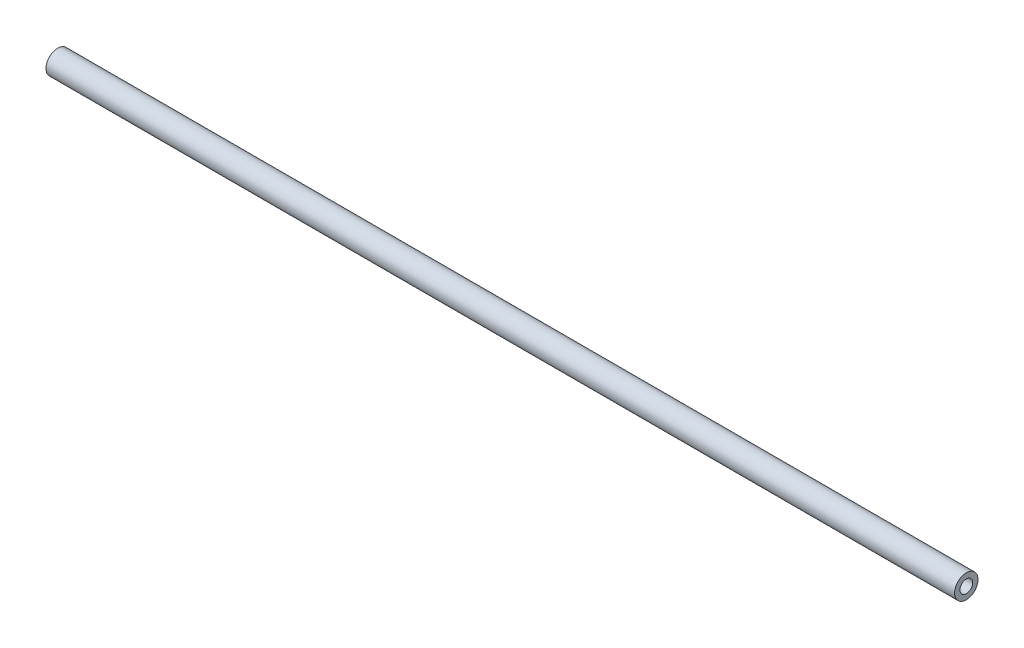
ISO-10303-21;
HEADER;
FILE_DESCRIPTION(('STEP AP214'),'2;1');
FILE_NAME('part.step','',(''),(''),'','','');
FILE_SCHEMA(('AUTOMOTIVE_DESIGN { 1 0 10303 214 1 1 1 1 }'));
ENDSEC;
DATA;
#1=APPLICATION_CONTEXT('core data for automotive mechanical design processes');
#2=APPLICATION_PROTOCOL_DEFINITION('international standard','automotive_design',2000,#1);
#3=PRODUCT_CONTEXT('',#1,'mechanical');
#4=PRODUCT('Part','Part','',(#3));
#5=PRODUCT_RELATED_PRODUCT_CATEGORY('part','',(#4));
#6=PRODUCT_DEFINITION_FORMATION('','',#4);
#7=PRODUCT_DEFINITION_CONTEXT('part definition',#1,'design');
#8=PRODUCT_DEFINITION('design','',#6,#7);
#9=PRODUCT_DEFINITION_SHAPE('','',#8);
#10=(LENGTH_UNIT() NAMED_UNIT(*) SI_UNIT(.MILLI.,.METRE.));
#11=(NAMED_UNIT(*) PLANE_ANGLE_UNIT() SI_UNIT($,.RADIAN.));
#12=(NAMED_UNIT(*) SI_UNIT($,.STERADIAN.) SOLID_ANGLE_UNIT());
#13=UNCERTAINTY_MEASURE_WITH_UNIT(LENGTH_MEASURE(1.E-05),#10,'distance_accuracy_value','');
#14=(GEOMETRIC_REPRESENTATION_CONTEXT(3) GLOBAL_UNCERTAINTY_ASSIGNED_CONTEXT((#13)) GLOBAL_UNIT_ASSIGNED_CONTEXT((#10,
#11,#12)) REPRESENTATION_CONTEXT('',''));
#15=CARTESIAN_POINT('',(0.,0.,0.));
#16=DIRECTION('',(0.,0.,1.));
#17=DIRECTION('',(1.,0.,0.));
#18=AXIS2_PLACEMENT_3D('',#15,#16,#17);
#19=CARTESIAN_POINT('',(123.19,0.,0.));
#20=DIRECTION('',(-1.,0.,0.));
#21=DIRECTION('',(0.,0.,1.));
#22=AXIS2_PLACEMENT_3D('',#19,#20,#21);
#23=CYLINDRICAL_SURFACE('',#22,3.175);
#24=CARTESIAN_POINT('',(123.19,0.,0.));
#25=DIRECTION('',(1.,0.,0.));
#26=DIRECTION('',(0.,0.,-1.));
#27=AXIS2_PLACEMENT_3D('',#24,#25,#26);
#28=CIRCLE('',#27,3.175);
#29=CARTESIAN_POINT('',(123.19,0.,3.175));
#30=VERTEX_POINT('',#29);
#31=EDGE_CURVE('E11',#30,#30,#28,.T.);
#32=CARTESIAN_POINT('',(-123.19,0.,0.));
#33=DIRECTION('',(1.,0.,0.));
#34=DIRECTION('',(0.,0.,-1.));
#35=AXIS2_PLACEMENT_3D('',#32,#33,#34);
#36=CIRCLE('',#35,3.175);
#37=CARTESIAN_POINT('',(-123.19,0.,3.175));
#38=VERTEX_POINT('',#37);
#39=EDGE_CURVE('E45',#38,#38,#36,.T.);
#40=CARTESIAN_POINT('',(123.19,0.,3.175));
#41=CARTESIAN_POINT('',(120.623541666667,0.,3.175));
#42=CARTESIAN_POINT('',(118.057083333333,0.,3.175));
#43=CARTESIAN_POINT('',(112.924166666667,0.,3.175));
#44=CARTESIAN_POINT('',(110.357708333333,0.,3.175));
#45=CARTESIAN_POINT('',(105.224791666667,0.,3.175));
#46=CARTESIAN_POINT('',(102.658333333333,0.,3.175));
#47=CARTESIAN_POINT('',(97.5254166666667,0.,3.175));
#48=CARTESIAN_POINT('',(94.9589583333333,0.,3.175));
#49=CARTESIAN_POINT('',(89.8260416666667,0.,3.175));
#50=CARTESIAN_POINT('',(87.2595833333333,0.,3.175));
#51=CARTESIAN_POINT('',(82.1266666666667,0.,3.175));
#52=CARTESIAN_POINT('',(79.5602083333333,0.,3.175));
#53=CARTESIAN_POINT('',(74.4272916666667,0.,3.175));
#54=CARTESIAN_POINT('',(71.8608333333333,0.,3.175));
#55=CARTESIAN_POINT('',(66.7279166666666,0.,3.175));
#56=CARTESIAN_POINT('',(64.1614583333333,0.,3.175));
#57=CARTESIAN_POINT('',(59.0285416666666,0.,3.175));
#58=CARTESIAN_POINT('',(56.4620833333333,0.,3.175));
#59=CARTESIAN_POINT('',(51.3291666666667,0.,3.175));
#60=CARTESIAN_POINT('',(48.7627083333333,0.,3.175));
#61=CARTESIAN_POINT('',(43.6297916666667,0.,3.175));
#62=CARTESIAN_POINT('',(41.0633333333333,0.,3.175));
#63=CARTESIAN_POINT('',(35.9304166666667,0.,3.175));
#64=CARTESIAN_POINT('',(33.3639583333333,0.,3.175));
#65=CARTESIAN_POINT('',(28.2310416666667,0.,3.175));
#66=CARTESIAN_POINT('',(25.6645833333333,0.,3.175));
#67=CARTESIAN_POINT('',(20.5316666666666,0.,3.175));
#68=CARTESIAN_POINT('',(17.9652083333333,0.,3.175));
#69=CARTESIAN_POINT('',(12.8322916666667,0.,3.175));
#70=CARTESIAN_POINT('',(10.2658333333333,0.,3.175));
#71=CARTESIAN_POINT('',(5.13291666666666,0.,3.175));
#72=CARTESIAN_POINT('',(2.56645833333332,0.,3.175));
#73=CARTESIAN_POINT('',(-2.56645833333335,0.,3.175));
#74=CARTESIAN_POINT('',(-5.13291666666668,0.,3.175));
#75=CARTESIAN_POINT('',(-10.2658333333333,0.,3.175));
#76=CARTESIAN_POINT('',(-12.8322916666667,0.,3.175));
#77=CARTESIAN_POINT('',(-17.9652083333333,0.,3.175));
#78=CARTESIAN_POINT('',(-20.5316666666667,0.,3.175));
#79=CARTESIAN_POINT('',(-25.6645833333333,0.,3.175));
#80=CARTESIAN_POINT('',(-28.2310416666667,0.,3.175));
#81=CARTESIAN_POINT('',(-33.3639583333333,0.,3.175));
#82=CARTESIAN_POINT('',(-35.9304166666667,0.,3.175));
#83=CARTESIAN_POINT('',(-41.0633333333333,0.,3.175));
#84=CARTESIAN_POINT('',(-43.6297916666667,0.,3.175));
#85=CARTESIAN_POINT('',(-48.7627083333333,0.,3.175));
#86=CARTESIAN_POINT('',(-51.3291666666667,0.,3.175));
#87=CARTESIAN_POINT('',(-56.4620833333333,0.,3.175));
#88=CARTESIAN_POINT('',(-59.0285416666667,0.,3.175));
#89=CARTESIAN_POINT('',(-64.1614583333334,0.,3.175));
#90=CARTESIAN_POINT('',(-66.7279166666667,0.,3.175));
#91=CARTESIAN_POINT('',(-71.8608333333334,0.,3.175));
#92=CARTESIAN_POINT('',(-74.4272916666667,0.,3.175));
#93=CARTESIAN_POINT('',(-79.5602083333333,0.,3.175));
#94=CARTESIAN_POINT('',(-82.1266666666667,0.,3.175));
#95=CARTESIAN_POINT('',(-87.2595833333334,0.,3.175));
#96=CARTESIAN_POINT('',(-89.8260416666667,0.,3.175));
#97=CARTESIAN_POINT('',(-94.9589583333334,0.,3.175));
#98=CARTESIAN_POINT('',(-97.5254166666667,0.,3.175));
#99=CARTESIAN_POINT('',(-102.658333333333,0.,3.175));
#100=CARTESIAN_POINT('',(-105.224791666667,0.,3.175));
#101=CARTESIAN_POINT('',(-110.357708333333,0.,3.175));
#102=CARTESIAN_POINT('',(-112.924166666667,0.,3.175));
#103=CARTESIAN_POINT('',(-118.057083333333,0.,3.175));
#104=CARTESIAN_POINT('',(-120.623541666667,0.,3.175));
#105=CARTESIAN_POINT('',(-123.19,0.,3.175));
#106=B_SPLINE_CURVE_WITH_KNOTS('',3,(#40,#41,#42,#43,#44,#45,#46,#47,#48,#49,#50,#51,#52,#53,
#54,#55,#56,#57,#58,#59,#60,#61,#62,#63,#64,#65,#66,#67,#68,#69,#70,#71,#72,#73,#74,#75,#76,#77,
#78,#79,#80,#81,#82,#83,#84,#85,#86,#87,#88,#89,#90,#91,#92,#93,#94,#95,#96,#97,#98,#99,#100,
#101,#102,#103,#104,#105),.UNSPECIFIED.,.F.,.F.,(4,2,2,2,2,2,2,2,2,2,2,2,2,2,2,2,2,2,2,2,2,2,2,
2,2,2,2,2,2,2,2,2,4),(0.,7.69937500000001,15.39875,23.098125,30.7975,38.496875,46.19625,
53.895625,61.595,69.294375,76.99375,84.693125,92.3925,100.091875,107.79125,115.490625,123.19,
130.889375,138.58875,146.288125,153.9875,161.686875,169.38625,177.085625,184.785,192.484375,
200.18375,207.883125,215.5825,223.281875,230.98125,238.680625,246.38),.UNSPECIFIED.);
#107=EDGE_CURVE('BSEAM42',#30,#38,#106,.T.);
#108=ORIENTED_EDGE('',*,*,#31,.F.);
#109=ORIENTED_EDGE('',*,*,#39,.T.);
#110=ORIENTED_EDGE('',*,*,#107,.T.);
#111=ORIENTED_EDGE('',*,*,#107,.F.);
#112=EDGE_LOOP('',(#108,#110,#109,#111));
#113=FACE_BOUND('',#112,.T.);
#114=ADVANCED_FACE('F42',(#113),#23,.T.);
#115=CARTESIAN_POINT('',(123.19,0.,0.));
#116=DIRECTION('',(1.,0.,0.));
#117=DIRECTION('',(0.,0.,-1.));
#118=AXIS2_PLACEMENT_3D('',#115,#116,#117);
#119=PLANE('',#118);
#120=CARTESIAN_POINT('',(123.19,0.,0.));
#121=DIRECTION('',(1.,0.,0.));
#122=DIRECTION('',(0.,0.,-1.));
#123=AXIS2_PLACEMENT_3D('',#120,#121,#122);
#124=CIRCLE('',#123,1.72719999999999);
#125=CARTESIAN_POINT('',(123.19,0.,-1.72719999999999));
#126=VERTEX_POINT('',#125);
#127=EDGE_CURVE('E67',#126,#126,#124,.T.);
#128=ORIENTED_EDGE('',*,*,#127,.F.);
#129=EDGE_LOOP('',(#128));
#130=FACE_BOUND('',#129,.T.);
#131=ORIENTED_EDGE('',*,*,#31,.T.);
#132=EDGE_LOOP('',(#131));
#133=FACE_BOUND('',#132,.T.);
#134=ADVANCED_FACE('F90',(#130,#133),#119,.T.);
#135=CARTESIAN_POINT('',(-123.19,0.,0.));
#136=DIRECTION('',(1.,0.,0.));
#137=DIRECTION('',(0.,0.,-1.));
#138=AXIS2_PLACEMENT_3D('',#135,#136,#137);
#139=PLANE('',#138);
#140=CARTESIAN_POINT('',(-123.19,0.,0.));
#141=DIRECTION('',(-1.,0.,0.));
#142=DIRECTION('',(0.,0.,1.));
#143=AXIS2_PLACEMENT_3D('',#140,#141,#142);
#144=CIRCLE('',#143,1.72719999999999);
#145=CARTESIAN_POINT('',(-123.19,0.,1.72719999999999));
#146=VERTEX_POINT('',#145);
#147=EDGE_CURVE('E68',#146,#146,#144,.T.);
#148=ORIENTED_EDGE('',*,*,#147,.F.);
#149=EDGE_LOOP('',(#148));
#150=FACE_BOUND('',#149,.T.);
#151=ORIENTED_EDGE('',*,*,#39,.F.);
#152=EDGE_LOOP('',(#151));
#153=FACE_BOUND('',#152,.T.);
#154=ADVANCED_FACE('F87',(#150,#153),#139,.F.);
#155=CARTESIAN_POINT('',(113.03,0.,0.));
#156=DIRECTION('',(1.,0.,0.));
#157=DIRECTION('',(0.,0.,-1.));
#158=AXIS2_PLACEMENT_3D('',#155,#156,#157);
#159=CONICAL_SURFACE('',#158,1.7272,1.02974425867665);
#160=CARTESIAN_POINT('',(111.992193538816,0.,0.));
#161=VERTEX_POINT('',#160);
#162=VERTEX_LOOP('',#161);
#163=FACE_BOUND('',#162,.T.);
#164=CARTESIAN_POINT('',(113.03,0.,0.));
#165=DIRECTION('',(1.,0.,0.));
#166=DIRECTION('',(0.,0.,-1.));
#167=AXIS2_PLACEMENT_3D('',#164,#165,#166);
#168=CIRCLE('',#167,1.7272);
#169=CARTESIAN_POINT('',(113.03,0.,-1.7272));
#170=VERTEX_POINT('',#169);
#171=EDGE_CURVE('E73',#170,#170,#168,.T.);
#172=ORIENTED_EDGE('',*,*,#171,.T.);
#173=EDGE_LOOP('',(#172));
#174=FACE_BOUND('',#173,.T.);
#175=ADVANCED_FACE('F89',(#163,#174),#159,.F.);
#176=CARTESIAN_POINT('',(123.19,0.,0.));
#177=DIRECTION('',(1.,0.,0.));
#178=DIRECTION('',(0.,0.,-1.));
#179=AXIS2_PLACEMENT_3D('',#176,#177,#178);
#180=CYLINDRICAL_SURFACE('',#179,1.72719999999999);
#181=ORIENTED_EDGE('',*,*,#171,.F.);
#182=EDGE_LOOP('',(#181));
#183=FACE_BOUND('',#182,.T.);
#184=ORIENTED_EDGE('',*,*,#127,.T.);
#185=EDGE_LOOP('',(#184));
#186=FACE_BOUND('',#185,.T.);
#187=ADVANCED_FACE('F60',(#183,#186),#180,.F.);
#188=CARTESIAN_POINT('',(-113.03,0.,0.));
#189=DIRECTION('',(-1.,0.,0.));
#190=DIRECTION('',(0.,0.,1.));
#191=AXIS2_PLACEMENT_3D('',#188,#189,#190);
#192=CONICAL_SURFACE('',#191,1.7272,1.02974425867665);
#193=CARTESIAN_POINT('',(-111.992193538816,0.,0.));
#194=VERTEX_POINT('',#193);
#195=VERTEX_LOOP('',#194);
#196=FACE_BOUND('',#195,.T.);
#197=CARTESIAN_POINT('',(-113.03,0.,0.));
#198=DIRECTION('',(-1.,0.,0.));
#199=DIRECTION('',(0.,0.,1.));
#200=AXIS2_PLACEMENT_3D('',#197,#198,#199);
#201=CIRCLE('',#200,1.7272);
#202=CARTESIAN_POINT('',(-113.03,0.,1.7272));
#203=VERTEX_POINT('',#202);
#204=EDGE_CURVE('E64',#203,#203,#201,.T.);
#205=ORIENTED_EDGE('',*,*,#204,.T.);
#206=EDGE_LOOP('',(#205));
#207=FACE_BOUND('',#206,.T.);
#208=ADVANCED_FACE('F56',(#196,#207),#192,.F.);
#209=CARTESIAN_POINT('',(-123.19,0.,0.));
#210=DIRECTION('',(-1.,0.,0.));
#211=DIRECTION('',(0.,0.,1.));
#212=AXIS2_PLACEMENT_3D('',#209,#210,#211);
#213=CYLINDRICAL_SURFACE('',#212,1.72719999999999);
#214=ORIENTED_EDGE('',*,*,#204,.F.);
#215=EDGE_LOOP('',(#214));
#216=FACE_BOUND('',#215,.T.);
#217=ORIENTED_EDGE('',*,*,#147,.T.);
#218=EDGE_LOOP('',(#217));
#219=FACE_BOUND('',#218,.T.);
#220=ADVANCED_FACE('F59',(#216,#219),#213,.F.);
#221=CLOSED_SHELL('',(#114,#134,#154,#175,#187,#208,#220));
#222=MANIFOLD_SOLID_BREP('B2',#221);
#223=ADVANCED_BREP_SHAPE_REPRESENTATION('',(#18,#222),#14);
#224=SHAPE_DEFINITION_REPRESENTATION(#9,#223);
ENDSEC;
END-ISO-10303-21;
